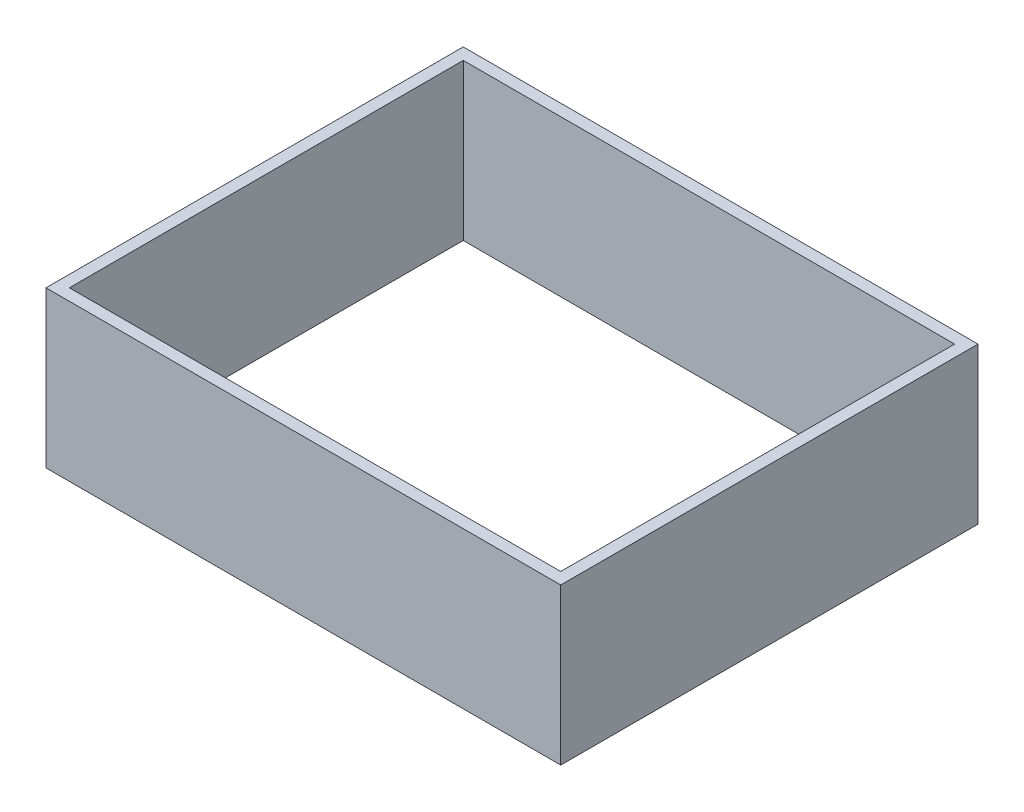
ISO-10303-21;
HEADER;
FILE_DESCRIPTION(('STEP AP214'),'2;1');
FILE_NAME('part.step','',(''),(''),'','','');
FILE_SCHEMA(('AUTOMOTIVE_DESIGN { 1 0 10303 214 1 1 1 1 }'));
ENDSEC;
DATA;
#1=APPLICATION_CONTEXT('core data for automotive mechanical design processes');
#2=APPLICATION_PROTOCOL_DEFINITION('international standard','automotive_design',2000,#1);
#3=PRODUCT_CONTEXT('',#1,'mechanical');
#4=PRODUCT('Part','Part','',(#3));
#5=PRODUCT_RELATED_PRODUCT_CATEGORY('part','',(#4));
#6=PRODUCT_DEFINITION_FORMATION('','',#4);
#7=PRODUCT_DEFINITION_CONTEXT('part definition',#1,'design');
#8=PRODUCT_DEFINITION('design','',#6,#7);
#9=PRODUCT_DEFINITION_SHAPE('','',#8);
#10=(LENGTH_UNIT() NAMED_UNIT(*) SI_UNIT(.MILLI.,.METRE.));
#11=(NAMED_UNIT(*) PLANE_ANGLE_UNIT() SI_UNIT($,.RADIAN.));
#12=(NAMED_UNIT(*) SI_UNIT($,.STERADIAN.) SOLID_ANGLE_UNIT());
#13=UNCERTAINTY_MEASURE_WITH_UNIT(LENGTH_MEASURE(1.E-05),#10,'distance_accuracy_value','');
#14=(GEOMETRIC_REPRESENTATION_CONTEXT(3) GLOBAL_UNCERTAINTY_ASSIGNED_CONTEXT((#13)) GLOBAL_UNIT_ASSIGNED_CONTEXT((#10,
#11,#12)) REPRESENTATION_CONTEXT('',''));
#15=CARTESIAN_POINT('',(0.,0.,0.));
#16=DIRECTION('',(0.,0.,1.));
#17=DIRECTION('',(1.,0.,0.));
#18=AXIS2_PLACEMENT_3D('',#15,#16,#17);
#19=CARTESIAN_POINT('',(0.,0.,1.5));
#20=DIRECTION('',(0.,0.,1.));
#21=DIRECTION('',(1.,0.,0.));
#22=AXIS2_PLACEMENT_3D('',#19,#20,#21);
#23=PLANE('',#22);
#24=DIRECTION('',(1.,0.,0.));
#25=VECTOR('',#24,1.);
#26=CARTESIAN_POINT('',(-33.,-10.,1.5));
#27=LINE('',#26,#25);
#28=CARTESIAN_POINT('',(-31.5,-10.,1.5));
#29=VERTEX_POINT('',#28);
#30=CARTESIAN_POINT('',(31.5,-10.,1.5));
#31=VERTEX_POINT('',#30);
#32=EDGE_CURVE('E54',#29,#31,#27,.T.);
#33=ORIENTED_EDGE('',*,*,#32,.T.);
#34=DIRECTION('',(0.,-1.,0.));
#35=VECTOR('',#34,1.);
#36=CARTESIAN_POINT('',(31.5,10.,1.5));
#37=LINE('',#36,#35);
#38=CARTESIAN_POINT('',(31.5,10.,1.5));
#39=VERTEX_POINT('',#38);
#40=EDGE_CURVE('E139',#39,#31,#37,.T.);
#41=ORIENTED_EDGE('',*,*,#40,.F.);
#42=DIRECTION('',(-1.,0.,0.));
#43=VECTOR('',#42,1.);
#44=CARTESIAN_POINT('',(33.,10.,1.5));
#45=LINE('',#44,#43);
#46=CARTESIAN_POINT('',(-31.5,10.,1.5));
#47=VERTEX_POINT('',#46);
#48=EDGE_CURVE('E155',#39,#47,#45,.T.);
#49=ORIENTED_EDGE('',*,*,#48,.T.);
#50=DIRECTION('',(0.,1.,0.));
#51=VECTOR('',#50,1.);
#52=CARTESIAN_POINT('',(-31.5,-10.,1.5));
#53=LINE('',#52,#51);
#54=EDGE_CURVE('E59',#29,#47,#53,.T.);
#55=ORIENTED_EDGE('',*,*,#54,.F.);
#56=EDGE_LOOP('',(#33,#41,#49,#55));
#57=FACE_BOUND('',#56,.T.);
#58=ADVANCED_FACE('F39',(#57),#23,.T.);
#59=CARTESIAN_POINT('',(-33.,10.,1.5));
#60=DIRECTION('',(1.,0.,0.));
#61=DIRECTION('',(0.,0.,-1.));
#62=AXIS2_PLACEMENT_3D('',#59,#60,#61);
#63=PLANE('',#62);
#64=DIRECTION('',(0.,-1.,0.));
#65=VECTOR('',#64,1.);
#66=CARTESIAN_POINT('',(-33.,10.,0.));
#67=LINE('',#66,#65);
#68=CARTESIAN_POINT('',(-33.,10.,0.));
#69=VERTEX_POINT('',#68);
#70=CARTESIAN_POINT('',(-33.,-10.,0.));
#71=VERTEX_POINT('',#70);
#72=EDGE_CURVE('E108',#69,#71,#67,.T.);
#73=ORIENTED_EDGE('',*,*,#72,.T.);
#74=DIRECTION('',(0.,0.,-1.));
#75=VECTOR('',#74,1.);
#76=CARTESIAN_POINT('',(-33.,-10.,1.5));
#77=LINE('',#76,#75);
#78=CARTESIAN_POINT('',(-33.,-10.,53.5));
#79=VERTEX_POINT('',#78);
#80=EDGE_CURVE('E11',#79,#71,#77,.T.);
#81=ORIENTED_EDGE('',*,*,#80,.F.);
#82=DIRECTION('',(0.,-1.,0.));
#83=VECTOR('',#82,1.);
#84=CARTESIAN_POINT('',(-33.,10.,53.5));
#85=LINE('',#84,#83);
#86=CARTESIAN_POINT('',(-33.,10.,53.5));
#87=VERTEX_POINT('',#86);
#88=EDGE_CURVE('E106',#87,#79,#85,.T.);
#89=ORIENTED_EDGE('',*,*,#88,.F.);
#90=DIRECTION('',(0.,0.,-1.));
#91=VECTOR('',#90,1.);
#92=CARTESIAN_POINT('',(-33.,10.,1.5));
#93=LINE('',#92,#91);
#94=EDGE_CURVE('E158',#87,#69,#93,.T.);
#95=ORIENTED_EDGE('',*,*,#94,.T.);
#96=EDGE_LOOP('',(#73,#81,#89,#95));
#97=FACE_BOUND('',#96,.T.);
#98=ADVANCED_FACE('F41',(#97),#63,.F.);
#99=CARTESIAN_POINT('',(-33.,-10.,1.5));
#100=DIRECTION('',(0.,1.,0.));
#101=DIRECTION('',(0.,0.,1.));
#102=AXIS2_PLACEMENT_3D('',#99,#100,#101);
#103=PLANE('',#102);
#104=DIRECTION('',(0.,0.,-1.));
#105=VECTOR('',#104,1.);
#106=CARTESIAN_POINT('',(-31.5,-10.,52.));
#107=LINE('',#106,#105);
#108=CARTESIAN_POINT('',(-31.5,-10.,52.));
#109=VERTEX_POINT('',#108);
#110=EDGE_CURVE('E151',#109,#29,#107,.T.);
#111=ORIENTED_EDGE('',*,*,#110,.F.);
#112=DIRECTION('',(1.,0.,0.));
#113=VECTOR('',#112,1.);
#114=CARTESIAN_POINT('',(-33.,-10.,52.));
#115=LINE('',#114,#113);
#116=CARTESIAN_POINT('',(31.5,-10.,52.));
#117=VERTEX_POINT('',#116);
#118=EDGE_CURVE('E126',#109,#117,#115,.T.);
#119=ORIENTED_EDGE('',*,*,#118,.T.);
#120=DIRECTION('',(0.,0.,-1.));
#121=VECTOR('',#120,1.);
#122=CARTESIAN_POINT('',(31.5,-10.,52.));
#123=LINE('',#122,#121);
#124=EDGE_CURVE('E131',#117,#31,#123,.T.);
#125=ORIENTED_EDGE('',*,*,#124,.T.);
#126=ORIENTED_EDGE('',*,*,#32,.F.);
#127=EDGE_LOOP('',(#111,#119,#125,#126));
#128=FACE_BOUND('',#127,.T.);
#129=DIRECTION('',(1.,0.,0.));
#130=VECTOR('',#129,1.);
#131=CARTESIAN_POINT('',(-33.,-10.,0.));
#132=LINE('',#131,#130);
#133=CARTESIAN_POINT('',(33.,-10.,0.));
#134=VERTEX_POINT('',#133);
#135=EDGE_CURVE('E160',#71,#134,#132,.T.);
#136=ORIENTED_EDGE('',*,*,#135,.T.);
#137=DIRECTION('',(0.,0.,-1.));
#138=VECTOR('',#137,1.);
#139=CARTESIAN_POINT('',(33.,-10.,1.5));
#140=LINE('',#139,#138);
#141=CARTESIAN_POINT('',(33.,-10.,53.5));
#142=VERTEX_POINT('',#141);
#143=EDGE_CURVE('E47',#142,#134,#140,.T.);
#144=ORIENTED_EDGE('',*,*,#143,.F.);
#145=DIRECTION('',(1.,0.,0.));
#146=VECTOR('',#145,1.);
#147=CARTESIAN_POINT('',(-33.,-10.,53.5));
#148=LINE('',#147,#146);
#149=EDGE_CURVE('E111',#79,#142,#148,.T.);
#150=ORIENTED_EDGE('',*,*,#149,.F.);
#151=ORIENTED_EDGE('',*,*,#80,.T.);
#152=EDGE_LOOP('',(#136,#144,#150,#151));
#153=FACE_BOUND('',#152,.T.);
#154=ADVANCED_FACE('F112',(#128,#153),#103,.F.);
#155=CARTESIAN_POINT('',(33.,-10.,1.5));
#156=DIRECTION('',(-1.,0.,0.));
#157=DIRECTION('',(0.,0.,1.));
#158=AXIS2_PLACEMENT_3D('',#155,#156,#157);
#159=PLANE('',#158);
#160=DIRECTION('',(0.,1.,0.));
#161=VECTOR('',#160,1.);
#162=CARTESIAN_POINT('',(33.,-10.,0.));
#163=LINE('',#162,#161);
#164=CARTESIAN_POINT('',(33.,10.,0.));
#165=VERTEX_POINT('',#164);
#166=EDGE_CURVE('E162',#134,#165,#163,.T.);
#167=ORIENTED_EDGE('',*,*,#166,.T.);
#168=DIRECTION('',(0.,0.,-1.));
#169=VECTOR('',#168,1.);
#170=CARTESIAN_POINT('',(33.,10.,1.5));
#171=LINE('',#170,#169);
#172=CARTESIAN_POINT('',(33.,10.,53.5));
#173=VERTEX_POINT('',#172);
#174=EDGE_CURVE('E166',#173,#165,#171,.T.);
#175=ORIENTED_EDGE('',*,*,#174,.F.);
#176=DIRECTION('',(0.,1.,0.));
#177=VECTOR('',#176,1.);
#178=CARTESIAN_POINT('',(33.,-10.,53.5));
#179=LINE('',#178,#177);
#180=EDGE_CURVE('E117',#142,#173,#179,.T.);
#181=ORIENTED_EDGE('',*,*,#180,.F.);
#182=ORIENTED_EDGE('',*,*,#143,.T.);
#183=EDGE_LOOP('',(#167,#175,#181,#182));
#184=FACE_BOUND('',#183,.T.);
#185=ADVANCED_FACE('F170',(#184),#159,.F.);
#186=CARTESIAN_POINT('',(33.,10.,1.5));
#187=DIRECTION('',(0.,-1.,0.));
#188=DIRECTION('',(0.,0.,-1.));
#189=AXIS2_PLACEMENT_3D('',#186,#187,#188);
#190=PLANE('',#189);
#191=ORIENTED_EDGE('',*,*,#94,.F.);
#192=DIRECTION('',(-1.,0.,0.));
#193=VECTOR('',#192,1.);
#194=CARTESIAN_POINT('',(33.,10.,53.5));
#195=LINE('',#194,#193);
#196=EDGE_CURVE('E122',#173,#87,#195,.T.);
#197=ORIENTED_EDGE('',*,*,#196,.F.);
#198=ORIENTED_EDGE('',*,*,#174,.T.);
#199=DIRECTION('',(-1.,0.,0.));
#200=VECTOR('',#199,1.);
#201=CARTESIAN_POINT('',(33.,10.,0.));
#202=LINE('',#201,#200);
#203=EDGE_CURVE('E156',#165,#69,#202,.T.);
#204=ORIENTED_EDGE('',*,*,#203,.T.);
#205=EDGE_LOOP('',(#191,#197,#198,#204));
#206=FACE_BOUND('',#205,.T.);
#207=DIRECTION('',(-1.,0.,0.));
#208=VECTOR('',#207,1.);
#209=CARTESIAN_POINT('',(33.,10.,52.));
#210=LINE('',#209,#208);
#211=CARTESIAN_POINT('',(31.5,10.,52.));
#212=VERTEX_POINT('',#211);
#213=CARTESIAN_POINT('',(-31.5,10.,52.));
#214=VERTEX_POINT('',#213);
#215=EDGE_CURVE('E123',#212,#214,#210,.T.);
#216=ORIENTED_EDGE('',*,*,#215,.T.);
#217=DIRECTION('',(0.,0.,-1.));
#218=VECTOR('',#217,1.);
#219=CARTESIAN_POINT('',(-31.5,10.,52.));
#220=LINE('',#219,#218);
#221=EDGE_CURVE('E147',#214,#47,#220,.T.);
#222=ORIENTED_EDGE('',*,*,#221,.T.);
#223=ORIENTED_EDGE('',*,*,#48,.F.);
#224=DIRECTION('',(0.,0.,-1.));
#225=VECTOR('',#224,1.);
#226=CARTESIAN_POINT('',(31.5,10.,52.));
#227=LINE('',#226,#225);
#228=EDGE_CURVE('E135',#212,#39,#227,.T.);
#229=ORIENTED_EDGE('',*,*,#228,.F.);
#230=EDGE_LOOP('',(#216,#222,#223,#229));
#231=FACE_BOUND('',#230,.T.);
#232=ADVANCED_FACE('F175',(#206,#231),#190,.F.);
#233=CARTESIAN_POINT('',(0.,0.,0.));
#234=DIRECTION('',(0.,0.,1.));
#235=DIRECTION('',(1.,0.,0.));
#236=AXIS2_PLACEMENT_3D('',#233,#234,#235);
#237=PLANE('',#236);
#238=ORIENTED_EDGE('',*,*,#72,.F.);
#239=ORIENTED_EDGE('',*,*,#203,.F.);
#240=ORIENTED_EDGE('',*,*,#166,.F.);
#241=ORIENTED_EDGE('',*,*,#135,.F.);
#242=EDGE_LOOP('',(#238,#239,#240,#241));
#243=FACE_BOUND('',#242,.T.);
#244=ADVANCED_FACE('F173',(#243),#237,.F.);
#245=CARTESIAN_POINT('',(-31.5,-10.,52.));
#246=DIRECTION('',(-1.,0.,0.));
#247=DIRECTION('',(0.,0.,1.));
#248=AXIS2_PLACEMENT_3D('',#245,#246,#247);
#249=PLANE('',#248);
#250=ORIENTED_EDGE('',*,*,#54,.T.);
#251=ORIENTED_EDGE('',*,*,#221,.F.);
#252=DIRECTION('',(0.,1.,0.));
#253=VECTOR('',#252,1.);
#254=CARTESIAN_POINT('',(-31.5,-10.,52.));
#255=LINE('',#254,#253);
#256=EDGE_CURVE('E144',#109,#214,#255,.T.);
#257=ORIENTED_EDGE('',*,*,#256,.F.);
#258=ORIENTED_EDGE('',*,*,#110,.T.);
#259=EDGE_LOOP('',(#250,#251,#257,#258));
#260=FACE_BOUND('',#259,.T.);
#261=ADVANCED_FACE('F186',(#260),#249,.F.);
#262=CARTESIAN_POINT('',(31.5,10.,52.));
#263=DIRECTION('',(1.,0.,0.));
#264=DIRECTION('',(0.,0.,-1.));
#265=AXIS2_PLACEMENT_3D('',#262,#263,#264);
#266=PLANE('',#265);
#267=ORIENTED_EDGE('',*,*,#40,.T.);
#268=ORIENTED_EDGE('',*,*,#124,.F.);
#269=DIRECTION('',(0.,-1.,0.));
#270=VECTOR('',#269,1.);
#271=CARTESIAN_POINT('',(31.5,10.,52.));
#272=LINE('',#271,#270);
#273=EDGE_CURVE('E138',#212,#117,#272,.T.);
#274=ORIENTED_EDGE('',*,*,#273,.F.);
#275=ORIENTED_EDGE('',*,*,#228,.T.);
#276=EDGE_LOOP('',(#267,#268,#274,#275));
#277=FACE_BOUND('',#276,.T.);
#278=ADVANCED_FACE('F189',(#277),#266,.F.);
#279=CARTESIAN_POINT('',(0.,0.,52.));
#280=DIRECTION('',(0.,0.,1.));
#281=DIRECTION('',(1.,0.,0.));
#282=AXIS2_PLACEMENT_3D('',#279,#280,#281);
#283=PLANE('',#282);
#284=ORIENTED_EDGE('',*,*,#118,.F.);
#285=ORIENTED_EDGE('',*,*,#256,.T.);
#286=ORIENTED_EDGE('',*,*,#215,.F.);
#287=ORIENTED_EDGE('',*,*,#273,.T.);
#288=EDGE_LOOP('',(#284,#285,#286,#287));
#289=FACE_BOUND('',#288,.T.);
#290=ADVANCED_FACE('F183',(#289),#283,.F.);
#291=CARTESIAN_POINT('',(0.,0.,53.5));
#292=DIRECTION('',(0.,0.,1.));
#293=DIRECTION('',(1.,0.,0.));
#294=AXIS2_PLACEMENT_3D('',#291,#292,#293);
#295=PLANE('',#294);
#296=ORIENTED_EDGE('',*,*,#88,.T.);
#297=ORIENTED_EDGE('',*,*,#149,.T.);
#298=ORIENTED_EDGE('',*,*,#180,.T.);
#299=ORIENTED_EDGE('',*,*,#196,.T.);
#300=EDGE_LOOP('',(#296,#297,#298,#299));
#301=FACE_BOUND('',#300,.T.);
#302=ADVANCED_FACE('F120',(#301),#295,.T.);
#303=CLOSED_SHELL('',(#58,#98,#154,#185,#232,#244,#261,#278,#290,#302));
#304=MANIFOLD_SOLID_BREP('B2',#303);
#305=ADVANCED_BREP_SHAPE_REPRESENTATION('',(#18,#304),#14);
#306=SHAPE_DEFINITION_REPRESENTATION(#9,#305);
ENDSEC;
END-ISO-10303-21;
